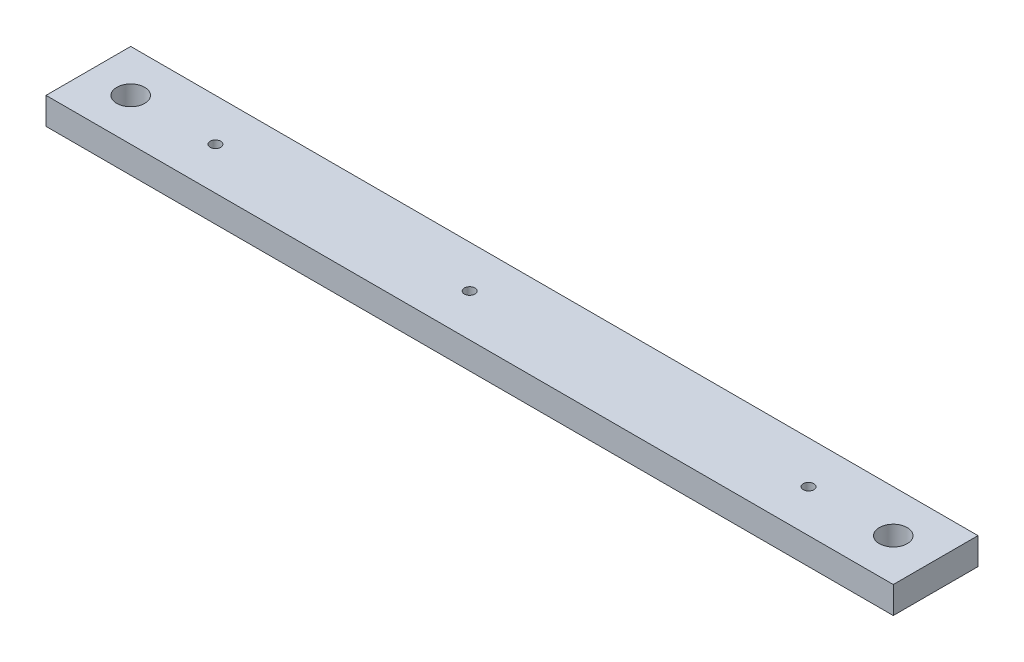
ISO-10303-21;
HEADER;
FILE_DESCRIPTION(('STEP AP214'),'2;1');
FILE_NAME('part.step','',(''),(''),'','','');
FILE_SCHEMA(('AUTOMOTIVE_DESIGN { 1 0 10303 214 1 1 1 1 }'));
ENDSEC;
DATA;
#1=APPLICATION_CONTEXT('core data for automotive mechanical design processes');
#2=APPLICATION_PROTOCOL_DEFINITION('international standard','automotive_design',2000,#1);
#3=PRODUCT_CONTEXT('',#1,'mechanical');
#4=PRODUCT('Part','Part','',(#3));
#5=PRODUCT_RELATED_PRODUCT_CATEGORY('part','',(#4));
#6=PRODUCT_DEFINITION_FORMATION('','',#4);
#7=PRODUCT_DEFINITION_CONTEXT('part definition',#1,'design');
#8=PRODUCT_DEFINITION('design','',#6,#7);
#9=PRODUCT_DEFINITION_SHAPE('','',#8);
#10=(LENGTH_UNIT() NAMED_UNIT(*) SI_UNIT(.MILLI.,.METRE.));
#11=(NAMED_UNIT(*) PLANE_ANGLE_UNIT() SI_UNIT($,.RADIAN.));
#12=(NAMED_UNIT(*) SI_UNIT($,.STERADIAN.) SOLID_ANGLE_UNIT());
#13=UNCERTAINTY_MEASURE_WITH_UNIT(LENGTH_MEASURE(1.E-05),#10,'distance_accuracy_value','');
#14=(GEOMETRIC_REPRESENTATION_CONTEXT(3) GLOBAL_UNCERTAINTY_ASSIGNED_CONTEXT((#13)) GLOBAL_UNIT_ASSIGNED_CONTEXT((#10,
#11,#12)) REPRESENTATION_CONTEXT('',''));
#15=CARTESIAN_POINT('',(0.,0.,0.));
#16=DIRECTION('',(0.,0.,1.));
#17=DIRECTION('',(1.,0.,0.));
#18=AXIS2_PLACEMENT_3D('',#15,#16,#17);
#19=CARTESIAN_POINT('',(0.,6.35,0.));
#20=DIRECTION('',(0.,-1.,0.));
#21=DIRECTION('',(0.,0.,-1.));
#22=AXIS2_PLACEMENT_3D('',#19,#20,#21);
#23=PLANE('',#22);
#24=CARTESIAN_POINT('',(190.,6.35,-10.));
#25=DIRECTION('',(0.,1.,0.));
#26=DIRECTION('',(0.,0.,1.));
#27=AXIS2_PLACEMENT_3D('',#24,#25,#26);
#28=CIRCLE('',#27,3.3);
#29=CARTESIAN_POINT('',(190.,6.35,-6.7));
#30=VERTEX_POINT('',#29);
#31=EDGE_CURVE('E144',#30,#30,#28,.T.);
#32=ORIENTED_EDGE('',*,*,#31,.F.);
#33=EDGE_LOOP('',(#32));
#34=FACE_BOUND('',#33,.T.);
#35=CARTESIAN_POINT('',(30.,6.35,-10.));
#36=DIRECTION('',(0.,1.,0.));
#37=DIRECTION('',(0.,0.,1.));
#38=AXIS2_PLACEMENT_3D('',#35,#36,#37);
#39=CIRCLE('',#38,1.25);
#40=CARTESIAN_POINT('',(30.,6.35,-8.75));
#41=VERTEX_POINT('',#40);
#42=EDGE_CURVE('E138',#41,#41,#39,.T.);
#43=ORIENTED_EDGE('',*,*,#42,.F.);
#44=EDGE_LOOP('',(#43));
#45=FACE_BOUND('',#44,.T.);
#46=CARTESIAN_POINT('',(170.,6.35,-10.));
#47=DIRECTION('',(0.,1.,0.));
#48=DIRECTION('',(0.,0.,1.));
#49=AXIS2_PLACEMENT_3D('',#46,#47,#48);
#50=CIRCLE('',#49,1.25);
#51=CARTESIAN_POINT('',(170.,6.35,-8.75));
#52=VERTEX_POINT('',#51);
#53=EDGE_CURVE('E132',#52,#52,#50,.T.);
#54=ORIENTED_EDGE('',*,*,#53,.F.);
#55=EDGE_LOOP('',(#54));
#56=FACE_BOUND('',#55,.T.);
#57=CARTESIAN_POINT('',(90.,6.35,-10.));
#58=DIRECTION('',(0.,1.,0.));
#59=DIRECTION('',(0.,0.,1.));
#60=AXIS2_PLACEMENT_3D('',#57,#58,#59);
#61=CIRCLE('',#60,1.25);
#62=CARTESIAN_POINT('',(90.,6.35,-8.75));
#63=VERTEX_POINT('',#62);
#64=EDGE_CURVE('E126',#63,#63,#61,.T.);
#65=ORIENTED_EDGE('',*,*,#64,.F.);
#66=EDGE_LOOP('',(#65));
#67=FACE_BOUND('',#66,.T.);
#68=DIRECTION('',(0.,0.,1.));
#69=VECTOR('',#68,1.);
#70=CARTESIAN_POINT('',(0.,6.35,0.));
#71=LINE('',#70,#69);
#72=CARTESIAN_POINT('',(0.,6.35,-20.));
#73=VERTEX_POINT('',#72);
#74=CARTESIAN_POINT('',(0.,6.35,0.));
#75=VERTEX_POINT('',#74);
#76=EDGE_CURVE('E97',#73,#75,#71,.T.);
#77=ORIENTED_EDGE('',*,*,#76,.T.);
#78=DIRECTION('',(1.,0.,0.));
#79=VECTOR('',#78,1.);
#80=CARTESIAN_POINT('',(0.,6.35,0.));
#81=LINE('',#80,#79);
#82=CARTESIAN_POINT('',(200.,6.35,0.));
#83=VERTEX_POINT('',#82);
#84=EDGE_CURVE('E92',#75,#83,#81,.T.);
#85=ORIENTED_EDGE('',*,*,#84,.T.);
#86=DIRECTION('',(0.,0.,-1.));
#87=VECTOR('',#86,1.);
#88=CARTESIAN_POINT('',(200.,6.35,0.));
#89=LINE('',#88,#87);
#90=CARTESIAN_POINT('',(200.,6.35,-20.));
#91=VERTEX_POINT('',#90);
#92=EDGE_CURVE('E95',#83,#91,#89,.T.);
#93=ORIENTED_EDGE('',*,*,#92,.T.);
#94=DIRECTION('',(-1.,0.,0.));
#95=VECTOR('',#94,1.);
#96=CARTESIAN_POINT('',(0.,6.35,-20.));
#97=LINE('',#96,#95);
#98=EDGE_CURVE('E62',#91,#73,#97,.T.);
#99=ORIENTED_EDGE('',*,*,#98,.T.);
#100=EDGE_LOOP('',(#77,#85,#93,#99));
#101=FACE_BOUND('',#100,.T.);
#102=CARTESIAN_POINT('',(10.,6.35,-10.));
#103=DIRECTION('',(0.,1.,0.));
#104=DIRECTION('',(0.,0.,1.));
#105=AXIS2_PLACEMENT_3D('',#102,#103,#104);
#106=CIRCLE('',#105,3.3);
#107=CARTESIAN_POINT('',(10.,6.35,-6.7));
#108=VERTEX_POINT('',#107);
#109=EDGE_CURVE('E150',#108,#108,#106,.T.);
#110=ORIENTED_EDGE('',*,*,#109,.F.);
#111=EDGE_LOOP('',(#110));
#112=FACE_BOUND('',#111,.T.);
#113=ADVANCED_FACE('F45',(#34,#45,#56,#67,#101,#112),#23,.F.);
#114=CARTESIAN_POINT('',(0.,0.,0.));
#115=DIRECTION('',(0.,-1.,0.));
#116=DIRECTION('',(0.,0.,-1.));
#117=AXIS2_PLACEMENT_3D('',#114,#115,#116);
#118=PLANE('',#117);
#119=CARTESIAN_POINT('',(10.,0.,-10.));
#120=DIRECTION('',(0.,1.,0.));
#121=DIRECTION('',(0.,0.,1.));
#122=AXIS2_PLACEMENT_3D('',#119,#120,#121);
#123=CIRCLE('',#122,3.3);
#124=CARTESIAN_POINT('',(10.,0.,-6.7));
#125=VERTEX_POINT('',#124);
#126=EDGE_CURVE('E147',#125,#125,#123,.T.);
#127=ORIENTED_EDGE('',*,*,#126,.T.);
#128=EDGE_LOOP('',(#127));
#129=FACE_BOUND('',#128,.T.);
#130=DIRECTION('',(0.,0.,1.));
#131=VECTOR('',#130,1.);
#132=CARTESIAN_POINT('',(0.,0.,0.));
#133=LINE('',#132,#131);
#134=CARTESIAN_POINT('',(0.,0.,-20.));
#135=VERTEX_POINT('',#134);
#136=CARTESIAN_POINT('',(0.,0.,0.));
#137=VERTEX_POINT('',#136);
#138=EDGE_CURVE('E109',#135,#137,#133,.T.);
#139=ORIENTED_EDGE('',*,*,#138,.F.);
#140=DIRECTION('',(-1.,0.,0.));
#141=VECTOR('',#140,1.);
#142=CARTESIAN_POINT('',(0.,0.,-20.));
#143=LINE('',#142,#141);
#144=CARTESIAN_POINT('',(200.,0.,-20.));
#145=VERTEX_POINT('',#144);
#146=EDGE_CURVE('E85',#145,#135,#143,.T.);
#147=ORIENTED_EDGE('',*,*,#146,.F.);
#148=DIRECTION('',(0.,0.,-1.));
#149=VECTOR('',#148,1.);
#150=CARTESIAN_POINT('',(200.,0.,0.));
#151=LINE('',#150,#149);
#152=CARTESIAN_POINT('',(200.,0.,0.));
#153=VERTEX_POINT('',#152);
#154=EDGE_CURVE('E79',#153,#145,#151,.T.);
#155=ORIENTED_EDGE('',*,*,#154,.F.);
#156=DIRECTION('',(1.,0.,0.));
#157=VECTOR('',#156,1.);
#158=CARTESIAN_POINT('',(0.,0.,0.));
#159=LINE('',#158,#157);
#160=EDGE_CURVE('E101',#137,#153,#159,.T.);
#161=ORIENTED_EDGE('',*,*,#160,.F.);
#162=EDGE_LOOP('',(#139,#147,#155,#161));
#163=FACE_BOUND('',#162,.T.);
#164=CARTESIAN_POINT('',(90.,0.,-10.));
#165=DIRECTION('',(0.,1.,0.));
#166=DIRECTION('',(0.,0.,1.));
#167=AXIS2_PLACEMENT_3D('',#164,#165,#166);
#168=CIRCLE('',#167,1.25);
#169=CARTESIAN_POINT('',(90.,0.,-8.75));
#170=VERTEX_POINT('',#169);
#171=EDGE_CURVE('E112',#170,#170,#168,.T.);
#172=ORIENTED_EDGE('',*,*,#171,.T.);
#173=EDGE_LOOP('',(#172));
#174=FACE_BOUND('',#173,.T.);
#175=CARTESIAN_POINT('',(170.,0.,-10.));
#176=DIRECTION('',(0.,1.,0.));
#177=DIRECTION('',(0.,0.,1.));
#178=AXIS2_PLACEMENT_3D('',#175,#176,#177);
#179=CIRCLE('',#178,1.25);
#180=CARTESIAN_POINT('',(170.,0.,-8.75));
#181=VERTEX_POINT('',#180);
#182=EDGE_CURVE('E129',#181,#181,#179,.T.);
#183=ORIENTED_EDGE('',*,*,#182,.T.);
#184=EDGE_LOOP('',(#183));
#185=FACE_BOUND('',#184,.T.);
#186=CARTESIAN_POINT('',(30.,0.,-10.));
#187=DIRECTION('',(0.,1.,0.));
#188=DIRECTION('',(0.,0.,1.));
#189=AXIS2_PLACEMENT_3D('',#186,#187,#188);
#190=CIRCLE('',#189,1.25);
#191=CARTESIAN_POINT('',(30.,0.,-8.75));
#192=VERTEX_POINT('',#191);
#193=EDGE_CURVE('E135',#192,#192,#190,.T.);
#194=ORIENTED_EDGE('',*,*,#193,.T.);
#195=EDGE_LOOP('',(#194));
#196=FACE_BOUND('',#195,.T.);
#197=CARTESIAN_POINT('',(190.,0.,-10.));
#198=DIRECTION('',(0.,1.,0.));
#199=DIRECTION('',(0.,0.,1.));
#200=AXIS2_PLACEMENT_3D('',#197,#198,#199);
#201=CIRCLE('',#200,3.3);
#202=CARTESIAN_POINT('',(190.,0.,-6.7));
#203=VERTEX_POINT('',#202);
#204=EDGE_CURVE('E141',#203,#203,#201,.T.);
#205=ORIENTED_EDGE('',*,*,#204,.T.);
#206=EDGE_LOOP('',(#205));
#207=FACE_BOUND('',#206,.T.);
#208=ADVANCED_FACE('F120',(#129,#163,#174,#185,#196,#207),#118,.T.);
#209=CARTESIAN_POINT('',(0.,6.35,0.));
#210=DIRECTION('',(1.,0.,0.));
#211=DIRECTION('',(0.,0.,-1.));
#212=AXIS2_PLACEMENT_3D('',#209,#210,#211);
#213=PLANE('',#212);
#214=ORIENTED_EDGE('',*,*,#138,.T.);
#215=DIRECTION('',(0.,-1.,0.));
#216=VECTOR('',#215,1.);
#217=CARTESIAN_POINT('',(0.,6.35,0.));
#218=LINE('',#217,#216);
#219=EDGE_CURVE('E11',#75,#137,#218,.T.);
#220=ORIENTED_EDGE('',*,*,#219,.F.);
#221=ORIENTED_EDGE('',*,*,#76,.F.);
#222=DIRECTION('',(0.,-1.,0.));
#223=VECTOR('',#222,1.);
#224=CARTESIAN_POINT('',(0.,6.35,-20.));
#225=LINE('',#224,#223);
#226=EDGE_CURVE('E105',#73,#135,#225,.T.);
#227=ORIENTED_EDGE('',*,*,#226,.T.);
#228=EDGE_LOOP('',(#214,#220,#221,#227));
#229=FACE_BOUND('',#228,.T.);
#230=ADVANCED_FACE('F47',(#229),#213,.F.);
#231=CARTESIAN_POINT('',(0.,6.35,0.));
#232=DIRECTION('',(0.,0.,-1.));
#233=DIRECTION('',(-1.,0.,0.));
#234=AXIS2_PLACEMENT_3D('',#231,#232,#233);
#235=PLANE('',#234);
#236=ORIENTED_EDGE('',*,*,#160,.T.);
#237=DIRECTION('',(0.,-1.,0.));
#238=VECTOR('',#237,1.);
#239=CARTESIAN_POINT('',(200.,6.35,0.));
#240=LINE('',#239,#238);
#241=EDGE_CURVE('E54',#83,#153,#240,.T.);
#242=ORIENTED_EDGE('',*,*,#241,.F.);
#243=ORIENTED_EDGE('',*,*,#84,.F.);
#244=ORIENTED_EDGE('',*,*,#219,.T.);
#245=EDGE_LOOP('',(#236,#242,#243,#244));
#246=FACE_BOUND('',#245,.T.);
#247=ADVANCED_FACE('F100',(#246),#235,.F.);
#248=CARTESIAN_POINT('',(200.,6.35,0.));
#249=DIRECTION('',(-1.,0.,0.));
#250=DIRECTION('',(0.,0.,1.));
#251=AXIS2_PLACEMENT_3D('',#248,#249,#250);
#252=PLANE('',#251);
#253=ORIENTED_EDGE('',*,*,#154,.T.);
#254=DIRECTION('',(0.,-1.,0.));
#255=VECTOR('',#254,1.);
#256=CARTESIAN_POINT('',(200.,6.35,-20.));
#257=LINE('',#256,#255);
#258=EDGE_CURVE('E102',#91,#145,#257,.T.);
#259=ORIENTED_EDGE('',*,*,#258,.F.);
#260=ORIENTED_EDGE('',*,*,#92,.F.);
#261=ORIENTED_EDGE('',*,*,#241,.T.);
#262=EDGE_LOOP('',(#253,#259,#260,#261));
#263=FACE_BOUND('',#262,.T.);
#264=ADVANCED_FACE('F103',(#263),#252,.F.);
#265=CARTESIAN_POINT('',(0.,6.35,-20.));
#266=DIRECTION('',(0.,0.,1.));
#267=DIRECTION('',(1.,0.,0.));
#268=AXIS2_PLACEMENT_3D('',#265,#266,#267);
#269=PLANE('',#268);
#270=ORIENTED_EDGE('',*,*,#146,.T.);
#271=ORIENTED_EDGE('',*,*,#226,.F.);
#272=ORIENTED_EDGE('',*,*,#98,.F.);
#273=ORIENTED_EDGE('',*,*,#258,.T.);
#274=EDGE_LOOP('',(#270,#271,#272,#273));
#275=FACE_BOUND('',#274,.T.);
#276=ADVANCED_FACE('F117',(#275),#269,.F.);
#277=CARTESIAN_POINT('',(90.,6.35,-10.));
#278=DIRECTION('',(0.,1.,0.));
#279=DIRECTION('',(0.,0.,1.));
#280=AXIS2_PLACEMENT_3D('',#277,#278,#279);
#281=CYLINDRICAL_SURFACE('',#280,1.25);
#282=ORIENTED_EDGE('',*,*,#171,.F.);
#283=EDGE_LOOP('',(#282));
#284=FACE_BOUND('',#283,.T.);
#285=ORIENTED_EDGE('',*,*,#64,.T.);
#286=EDGE_LOOP('',(#285));
#287=FACE_BOUND('',#286,.T.);
#288=ADVANCED_FACE('F167',(#284,#287),#281,.F.);
#289=CARTESIAN_POINT('',(170.,6.35,-10.));
#290=DIRECTION('',(0.,1.,0.));
#291=DIRECTION('',(0.,0.,1.));
#292=AXIS2_PLACEMENT_3D('',#289,#290,#291);
#293=CYLINDRICAL_SURFACE('',#292,1.25);
#294=ORIENTED_EDGE('',*,*,#182,.F.);
#295=EDGE_LOOP('',(#294));
#296=FACE_BOUND('',#295,.T.);
#297=ORIENTED_EDGE('',*,*,#53,.T.);
#298=EDGE_LOOP('',(#297));
#299=FACE_BOUND('',#298,.T.);
#300=ADVANCED_FACE('F206',(#296,#299),#293,.F.);
#301=CARTESIAN_POINT('',(30.,6.35,-10.));
#302=DIRECTION('',(0.,1.,0.));
#303=DIRECTION('',(0.,0.,1.));
#304=AXIS2_PLACEMENT_3D('',#301,#302,#303);
#305=CYLINDRICAL_SURFACE('',#304,1.25);
#306=ORIENTED_EDGE('',*,*,#193,.F.);
#307=EDGE_LOOP('',(#306));
#308=FACE_BOUND('',#307,.T.);
#309=ORIENTED_EDGE('',*,*,#42,.T.);
#310=EDGE_LOOP('',(#309));
#311=FACE_BOUND('',#310,.T.);
#312=ADVANCED_FACE('F217',(#308,#311),#305,.F.);
#313=CARTESIAN_POINT('',(190.,6.35,-10.));
#314=DIRECTION('',(0.,1.,0.));
#315=DIRECTION('',(0.,0.,1.));
#316=AXIS2_PLACEMENT_3D('',#313,#314,#315);
#317=CYLINDRICAL_SURFACE('',#316,3.3);
#318=ORIENTED_EDGE('',*,*,#204,.F.);
#319=EDGE_LOOP('',(#318));
#320=FACE_BOUND('',#319,.T.);
#321=ORIENTED_EDGE('',*,*,#31,.T.);
#322=EDGE_LOOP('',(#321));
#323=FACE_BOUND('',#322,.T.);
#324=ADVANCED_FACE('F227',(#320,#323),#317,.F.);
#325=CARTESIAN_POINT('',(10.,6.35,-10.));
#326=DIRECTION('',(0.,1.,0.));
#327=DIRECTION('',(0.,0.,1.));
#328=AXIS2_PLACEMENT_3D('',#325,#326,#327);
#329=CYLINDRICAL_SURFACE('',#328,3.3);
#330=ORIENTED_EDGE('',*,*,#126,.F.);
#331=EDGE_LOOP('',(#330));
#332=FACE_BOUND('',#331,.T.);
#333=ORIENTED_EDGE('',*,*,#109,.T.);
#334=EDGE_LOOP('',(#333));
#335=FACE_BOUND('',#334,.T.);
#336=ADVANCED_FACE('F154',(#332,#335),#329,.F.);
#337=CLOSED_SHELL('',(#113,#208,#230,#247,#264,#276,#288,#300,#312,#324,#336));
#338=MANIFOLD_SOLID_BREP('B2',#337);
#339=ADVANCED_BREP_SHAPE_REPRESENTATION('',(#18,#338),#14);
#340=SHAPE_DEFINITION_REPRESENTATION(#9,#339);
ENDSEC;
END-ISO-10303-21;
